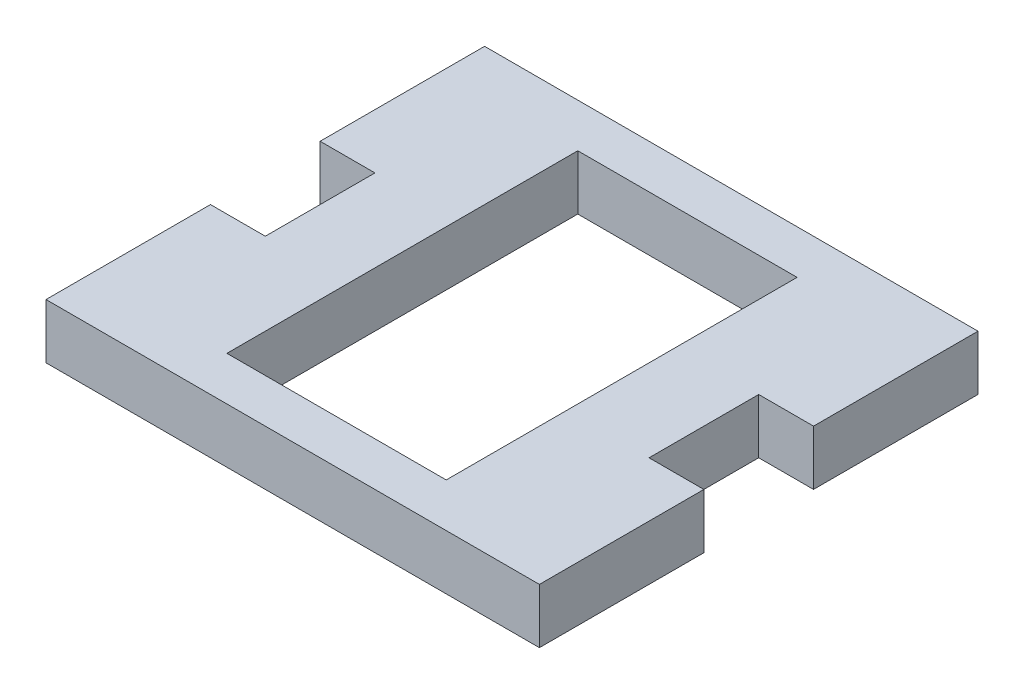
ISO-10303-21;
HEADER;
FILE_DESCRIPTION(('STEP AP214'),'2;1');
FILE_NAME('part.step','',(''),(''),'','','');
FILE_SCHEMA(('AUTOMOTIVE_DESIGN { 1 0 10303 214 1 1 1 1 }'));
ENDSEC;
DATA;
#1=APPLICATION_CONTEXT('core data for automotive mechanical design processes');
#2=APPLICATION_PROTOCOL_DEFINITION('international standard','automotive_design',2000,#1);
#3=PRODUCT_CONTEXT('',#1,'mechanical');
#4=PRODUCT('Part','Part','',(#3));
#5=PRODUCT_RELATED_PRODUCT_CATEGORY('part','',(#4));
#6=PRODUCT_DEFINITION_FORMATION('','',#4);
#7=PRODUCT_DEFINITION_CONTEXT('part definition',#1,'design');
#8=PRODUCT_DEFINITION('design','',#6,#7);
#9=PRODUCT_DEFINITION_SHAPE('','',#8);
#10=(LENGTH_UNIT() NAMED_UNIT(*) SI_UNIT(.MILLI.,.METRE.));
#11=(NAMED_UNIT(*) PLANE_ANGLE_UNIT() SI_UNIT($,.RADIAN.));
#12=(NAMED_UNIT(*) SI_UNIT($,.STERADIAN.) SOLID_ANGLE_UNIT());
#13=UNCERTAINTY_MEASURE_WITH_UNIT(LENGTH_MEASURE(1.E-05),#10,'distance_accuracy_value','');
#14=(GEOMETRIC_REPRESENTATION_CONTEXT(3) GLOBAL_UNCERTAINTY_ASSIGNED_CONTEXT((#13)) GLOBAL_UNIT_ASSIGNED_CONTEXT((#10,
#11,#12)) REPRESENTATION_CONTEXT('',''));
#15=CARTESIAN_POINT('',(0.,0.,0.));
#16=DIRECTION('',(0.,0.,1.));
#17=DIRECTION('',(1.,0.,0.));
#18=AXIS2_PLACEMENT_3D('',#15,#16,#17);
#19=CARTESIAN_POINT('',(0.,3.175,0.));
#20=DIRECTION('',(0.,-1.,0.));
#21=DIRECTION('',(0.,0.,-1.));
#22=AXIS2_PLACEMENT_3D('',#19,#20,#21);
#23=PLANE('',#22);
#24=DIRECTION('',(0.,0.,-1.));
#25=VECTOR('',#24,1.);
#26=CARTESIAN_POINT('',(14.2875,3.175,-12.7));
#27=LINE('',#26,#25);
#28=CARTESIAN_POINT('',(14.2875,3.175,-3.175));
#29=VERTEX_POINT('',#28);
#30=CARTESIAN_POINT('',(14.2875,3.175,-12.7));
#31=VERTEX_POINT('',#30);
#32=EDGE_CURVE('E184',#29,#31,#27,.T.);
#33=ORIENTED_EDGE('',*,*,#32,.T.);
#34=DIRECTION('',(-1.,0.,0.));
#35=VECTOR('',#34,1.);
#36=CARTESIAN_POINT('',(-14.2875,3.175,-12.7));
#37=LINE('',#36,#35);
#38=CARTESIAN_POINT('',(-14.2875,3.175,-12.7));
#39=VERTEX_POINT('',#38);
#40=EDGE_CURVE('E187',#31,#39,#37,.T.);
#41=ORIENTED_EDGE('',*,*,#40,.T.);
#42=DIRECTION('',(0.,0.,1.));
#43=VECTOR('',#42,1.);
#44=CARTESIAN_POINT('',(-14.2875,3.175,-12.7));
#45=LINE('',#44,#43);
#46=CARTESIAN_POINT('',(-14.2875,3.175,-3.175));
#47=VERTEX_POINT('',#46);
#48=EDGE_CURVE('E190',#39,#47,#45,.T.);
#49=ORIENTED_EDGE('',*,*,#48,.T.);
#50=DIRECTION('',(1.,0.,0.));
#51=VECTOR('',#50,1.);
#52=CARTESIAN_POINT('',(-14.2875,3.175,-3.175));
#53=LINE('',#52,#51);
#54=CARTESIAN_POINT('',(-11.1125,3.175,-3.175));
#55=VERTEX_POINT('',#54);
#56=EDGE_CURVE('E192',#47,#55,#53,.T.);
#57=ORIENTED_EDGE('',*,*,#56,.T.);
#58=DIRECTION('',(0.,0.,1.));
#59=VECTOR('',#58,1.);
#60=CARTESIAN_POINT('',(-11.1125,3.175,-3.175));
#61=LINE('',#60,#59);
#62=CARTESIAN_POINT('',(-11.1125,3.175,3.175));
#63=VERTEX_POINT('',#62);
#64=EDGE_CURVE('E194',#55,#63,#61,.T.);
#65=ORIENTED_EDGE('',*,*,#64,.T.);
#66=DIRECTION('',(-1.,0.,0.));
#67=VECTOR('',#66,1.);
#68=CARTESIAN_POINT('',(-11.1125,3.175,3.175));
#69=LINE('',#68,#67);
#70=CARTESIAN_POINT('',(-14.2875,3.175,3.175));
#71=VERTEX_POINT('',#70);
#72=EDGE_CURVE('E196',#63,#71,#69,.T.);
#73=ORIENTED_EDGE('',*,*,#72,.T.);
#74=DIRECTION('',(0.,0.,1.));
#75=VECTOR('',#74,1.);
#76=CARTESIAN_POINT('',(-14.2875,3.175,12.7));
#77=LINE('',#76,#75);
#78=CARTESIAN_POINT('',(-14.2875,3.175,12.7));
#79=VERTEX_POINT('',#78);
#80=EDGE_CURVE('E198',#71,#79,#77,.T.);
#81=ORIENTED_EDGE('',*,*,#80,.T.);
#82=DIRECTION('',(1.,0.,0.));
#83=VECTOR('',#82,1.);
#84=CARTESIAN_POINT('',(-14.2875,3.175,12.7));
#85=LINE('',#84,#83);
#86=CARTESIAN_POINT('',(14.2875,3.175,12.7));
#87=VERTEX_POINT('',#86);
#88=EDGE_CURVE('E200',#79,#87,#85,.T.);
#89=ORIENTED_EDGE('',*,*,#88,.T.);
#90=DIRECTION('',(0.,0.,-1.));
#91=VECTOR('',#90,1.);
#92=CARTESIAN_POINT('',(14.2875,3.175,12.7));
#93=LINE('',#92,#91);
#94=CARTESIAN_POINT('',(14.2875,3.175,3.175));
#95=VERTEX_POINT('',#94);
#96=EDGE_CURVE('E202',#87,#95,#93,.T.);
#97=ORIENTED_EDGE('',*,*,#96,.T.);
#98=DIRECTION('',(-1.,0.,0.));
#99=VECTOR('',#98,1.);
#100=CARTESIAN_POINT('',(11.1125,3.175,3.175));
#101=LINE('',#100,#99);
#102=CARTESIAN_POINT('',(11.1125,3.175,3.175));
#103=VERTEX_POINT('',#102);
#104=EDGE_CURVE('E204',#95,#103,#101,.T.);
#105=ORIENTED_EDGE('',*,*,#104,.T.);
#106=DIRECTION('',(0.,0.,-1.));
#107=VECTOR('',#106,1.);
#108=CARTESIAN_POINT('',(11.1125,3.175,-3.175));
#109=LINE('',#108,#107);
#110=CARTESIAN_POINT('',(11.1125,3.175,-3.175));
#111=VERTEX_POINT('',#110);
#112=EDGE_CURVE('E206',#103,#111,#109,.T.);
#113=ORIENTED_EDGE('',*,*,#112,.T.);
#114=DIRECTION('',(1.,0.,0.));
#115=VECTOR('',#114,1.);
#116=CARTESIAN_POINT('',(14.2875,3.175,-3.175));
#117=LINE('',#116,#115);
#118=EDGE_CURVE('E208',#111,#29,#117,.T.);
#119=ORIENTED_EDGE('',*,*,#118,.T.);
#120=EDGE_LOOP('',(#33,#41,#49,#57,#65,#73,#81,#89,#97,#105,#113,#119));
#121=FACE_BOUND('',#120,.T.);
#122=DIRECTION('',(0.,0.,-1.));
#123=VECTOR('',#122,1.);
#124=CARTESIAN_POINT('',(6.35,3.175,10.16));
#125=LINE('',#124,#123);
#126=CARTESIAN_POINT('',(6.35,3.175,10.16));
#127=VERTEX_POINT('',#126);
#128=CARTESIAN_POINT('',(6.35,3.175,-10.16));
#129=VERTEX_POINT('',#128);
#130=EDGE_CURVE('E148',#127,#129,#125,.T.);
#131=ORIENTED_EDGE('',*,*,#130,.F.);
#132=DIRECTION('',(1.,0.,0.));
#133=VECTOR('',#132,1.);
#134=CARTESIAN_POINT('',(-6.35,3.175,10.16));
#135=LINE('',#134,#133);
#136=CARTESIAN_POINT('',(-6.35,3.175,10.16));
#137=VERTEX_POINT('',#136);
#138=EDGE_CURVE('E170',#137,#127,#135,.T.);
#139=ORIENTED_EDGE('',*,*,#138,.F.);
#140=DIRECTION('',(0.,0.,1.));
#141=VECTOR('',#140,1.);
#142=CARTESIAN_POINT('',(-6.35,3.175,10.16));
#143=LINE('',#142,#141);
#144=CARTESIAN_POINT('',(-6.35,3.175,-10.16));
#145=VERTEX_POINT('',#144);
#146=EDGE_CURVE('E168',#145,#137,#143,.T.);
#147=ORIENTED_EDGE('',*,*,#146,.F.);
#148=DIRECTION('',(-1.,0.,0.));
#149=VECTOR('',#148,1.);
#150=CARTESIAN_POINT('',(-6.35,3.175,-10.16));
#151=LINE('',#150,#149);
#152=EDGE_CURVE('E156',#129,#145,#151,.T.);
#153=ORIENTED_EDGE('',*,*,#152,.F.);
#154=EDGE_LOOP('',(#131,#139,#147,#153));
#155=FACE_BOUND('',#154,.T.);
#156=ADVANCED_FACE('F35',(#121,#155),#23,.F.);
#157=CARTESIAN_POINT('',(0.,0.,0.));
#158=DIRECTION('',(0.,-1.,0.));
#159=DIRECTION('',(0.,0.,-1.));
#160=AXIS2_PLACEMENT_3D('',#157,#158,#159);
#161=PLANE('',#160);
#162=DIRECTION('',(0.,0.,-1.));
#163=VECTOR('',#162,1.);
#164=CARTESIAN_POINT('',(14.2875,0.,-12.7));
#165=LINE('',#164,#163);
#166=CARTESIAN_POINT('',(14.2875,0.,-3.175));
#167=VERTEX_POINT('',#166);
#168=CARTESIAN_POINT('',(14.2875,0.,-12.7));
#169=VERTEX_POINT('',#168);
#170=EDGE_CURVE('E164',#167,#169,#165,.T.);
#171=ORIENTED_EDGE('',*,*,#170,.F.);
#172=DIRECTION('',(1.,0.,0.));
#173=VECTOR('',#172,1.);
#174=CARTESIAN_POINT('',(14.2875,0.,-3.175));
#175=LINE('',#174,#173);
#176=CARTESIAN_POINT('',(11.1125,0.,-3.175));
#177=VERTEX_POINT('',#176);
#178=EDGE_CURVE('E188',#177,#167,#175,.T.);
#179=ORIENTED_EDGE('',*,*,#178,.F.);
#180=DIRECTION('',(0.,0.,-1.));
#181=VECTOR('',#180,1.);
#182=CARTESIAN_POINT('',(11.1125,0.,-3.175));
#183=LINE('',#182,#181);
#184=CARTESIAN_POINT('',(11.1125,0.,3.175));
#185=VERTEX_POINT('',#184);
#186=EDGE_CURVE('E231',#185,#177,#183,.T.);
#187=ORIENTED_EDGE('',*,*,#186,.F.);
#188=DIRECTION('',(-1.,0.,0.));
#189=VECTOR('',#188,1.);
#190=CARTESIAN_POINT('',(11.1125,0.,3.175));
#191=LINE('',#190,#189);
#192=CARTESIAN_POINT('',(14.2875,0.,3.175));
#193=VERTEX_POINT('',#192);
#194=EDGE_CURVE('E229',#193,#185,#191,.T.);
#195=ORIENTED_EDGE('',*,*,#194,.F.);
#196=DIRECTION('',(0.,0.,-1.));
#197=VECTOR('',#196,1.);
#198=CARTESIAN_POINT('',(14.2875,0.,12.7));
#199=LINE('',#198,#197);
#200=CARTESIAN_POINT('',(14.2875,0.,12.7));
#201=VERTEX_POINT('',#200);
#202=EDGE_CURVE('E227',#201,#193,#199,.T.);
#203=ORIENTED_EDGE('',*,*,#202,.F.);
#204=DIRECTION('',(1.,0.,0.));
#205=VECTOR('',#204,1.);
#206=CARTESIAN_POINT('',(-14.2875,0.,12.7));
#207=LINE('',#206,#205);
#208=CARTESIAN_POINT('',(-14.2875,0.,12.7));
#209=VERTEX_POINT('',#208);
#210=EDGE_CURVE('E225',#209,#201,#207,.T.);
#211=ORIENTED_EDGE('',*,*,#210,.F.);
#212=DIRECTION('',(0.,0.,1.));
#213=VECTOR('',#212,1.);
#214=CARTESIAN_POINT('',(-14.2875,0.,12.7));
#215=LINE('',#214,#213);
#216=CARTESIAN_POINT('',(-14.2875,0.,3.175));
#217=VERTEX_POINT('',#216);
#218=EDGE_CURVE('E223',#217,#209,#215,.T.);
#219=ORIENTED_EDGE('',*,*,#218,.F.);
#220=DIRECTION('',(-1.,0.,0.));
#221=VECTOR('',#220,1.);
#222=CARTESIAN_POINT('',(-11.1125,0.,3.175));
#223=LINE('',#222,#221);
#224=CARTESIAN_POINT('',(-11.1125,0.,3.175));
#225=VERTEX_POINT('',#224);
#226=EDGE_CURVE('E221',#225,#217,#223,.T.);
#227=ORIENTED_EDGE('',*,*,#226,.F.);
#228=DIRECTION('',(0.,0.,1.));
#229=VECTOR('',#228,1.);
#230=CARTESIAN_POINT('',(-11.1125,0.,-3.175));
#231=LINE('',#230,#229);
#232=CARTESIAN_POINT('',(-11.1125,0.,-3.175));
#233=VERTEX_POINT('',#232);
#234=EDGE_CURVE('E219',#233,#225,#231,.T.);
#235=ORIENTED_EDGE('',*,*,#234,.F.);
#236=DIRECTION('',(1.,0.,0.));
#237=VECTOR('',#236,1.);
#238=CARTESIAN_POINT('',(-14.2875,0.,-3.175));
#239=LINE('',#238,#237);
#240=CARTESIAN_POINT('',(-14.2875,0.,-3.175));
#241=VERTEX_POINT('',#240);
#242=EDGE_CURVE('E217',#241,#233,#239,.T.);
#243=ORIENTED_EDGE('',*,*,#242,.F.);
#244=DIRECTION('',(0.,0.,1.));
#245=VECTOR('',#244,1.);
#246=CARTESIAN_POINT('',(-14.2875,0.,-12.7));
#247=LINE('',#246,#245);
#248=CARTESIAN_POINT('',(-14.2875,0.,-12.7));
#249=VERTEX_POINT('',#248);
#250=EDGE_CURVE('E215',#249,#241,#247,.T.);
#251=ORIENTED_EDGE('',*,*,#250,.F.);
#252=DIRECTION('',(-1.,0.,0.));
#253=VECTOR('',#252,1.);
#254=CARTESIAN_POINT('',(-14.2875,0.,-12.7));
#255=LINE('',#254,#253);
#256=EDGE_CURVE('E213',#169,#249,#255,.T.);
#257=ORIENTED_EDGE('',*,*,#256,.F.);
#258=EDGE_LOOP('',(#171,#179,#187,#195,#203,#211,#219,#227,#235,#243,#251,#257));
#259=FACE_BOUND('',#258,.T.);
#260=DIRECTION('',(1.,0.,0.));
#261=VECTOR('',#260,1.);
#262=CARTESIAN_POINT('',(-6.35,0.,10.16));
#263=LINE('',#262,#261);
#264=CARTESIAN_POINT('',(-6.35,0.,10.16));
#265=VERTEX_POINT('',#264);
#266=CARTESIAN_POINT('',(6.35,0.,10.16));
#267=VERTEX_POINT('',#266);
#268=EDGE_CURVE('E157',#265,#267,#263,.T.);
#269=ORIENTED_EDGE('',*,*,#268,.T.);
#270=DIRECTION('',(0.,0.,-1.));
#271=VECTOR('',#270,1.);
#272=CARTESIAN_POINT('',(6.35,0.,10.16));
#273=LINE('',#272,#271);
#274=CARTESIAN_POINT('',(6.35,0.,-10.16));
#275=VERTEX_POINT('',#274);
#276=EDGE_CURVE('E58',#267,#275,#273,.T.);
#277=ORIENTED_EDGE('',*,*,#276,.T.);
#278=DIRECTION('',(-1.,0.,0.));
#279=VECTOR('',#278,1.);
#280=CARTESIAN_POINT('',(-6.35,0.,-10.16));
#281=LINE('',#280,#279);
#282=CARTESIAN_POINT('',(-6.35,0.,-10.16));
#283=VERTEX_POINT('',#282);
#284=EDGE_CURVE('E163',#275,#283,#281,.T.);
#285=ORIENTED_EDGE('',*,*,#284,.T.);
#286=DIRECTION('',(0.,0.,1.));
#287=VECTOR('',#286,1.);
#288=CARTESIAN_POINT('',(-6.35,0.,10.16));
#289=LINE('',#288,#287);
#290=EDGE_CURVE('E176',#283,#265,#289,.T.);
#291=ORIENTED_EDGE('',*,*,#290,.T.);
#292=EDGE_LOOP('',(#269,#277,#285,#291));
#293=FACE_BOUND('',#292,.T.);
#294=ADVANCED_FACE('F273',(#259,#293),#161,.T.);
#295=CARTESIAN_POINT('',(14.2875,3.175,-12.7));
#296=DIRECTION('',(-1.,0.,0.));
#297=DIRECTION('',(0.,0.,1.));
#298=AXIS2_PLACEMENT_3D('',#295,#296,#297);
#299=PLANE('',#298);
#300=ORIENTED_EDGE('',*,*,#170,.T.);
#301=DIRECTION('',(0.,-1.,0.));
#302=VECTOR('',#301,1.);
#303=CARTESIAN_POINT('',(14.2875,3.175,-12.7));
#304=LINE('',#303,#302);
#305=EDGE_CURVE('E11',#31,#169,#304,.T.);
#306=ORIENTED_EDGE('',*,*,#305,.F.);
#307=ORIENTED_EDGE('',*,*,#32,.F.);
#308=DIRECTION('',(0.,-1.,0.));
#309=VECTOR('',#308,1.);
#310=CARTESIAN_POINT('',(14.2875,3.175,-3.175));
#311=LINE('',#310,#309);
#312=EDGE_CURVE('E210',#29,#167,#311,.T.);
#313=ORIENTED_EDGE('',*,*,#312,.T.);
#314=EDGE_LOOP('',(#300,#306,#307,#313));
#315=FACE_BOUND('',#314,.T.);
#316=ADVANCED_FACE('F37',(#315),#299,.F.);
#317=CARTESIAN_POINT('',(-14.2875,3.175,-12.7));
#318=DIRECTION('',(0.,0.,1.));
#319=DIRECTION('',(1.,0.,0.));
#320=AXIS2_PLACEMENT_3D('',#317,#318,#319);
#321=PLANE('',#320);
#322=ORIENTED_EDGE('',*,*,#256,.T.);
#323=DIRECTION('',(0.,-1.,0.));
#324=VECTOR('',#323,1.);
#325=CARTESIAN_POINT('',(-14.2875,3.175,-12.7));
#326=LINE('',#325,#324);
#327=EDGE_CURVE('E43',#39,#249,#326,.T.);
#328=ORIENTED_EDGE('',*,*,#327,.F.);
#329=ORIENTED_EDGE('',*,*,#40,.F.);
#330=ORIENTED_EDGE('',*,*,#305,.T.);
#331=EDGE_LOOP('',(#322,#328,#329,#330));
#332=FACE_BOUND('',#331,.T.);
#333=ADVANCED_FACE('F290',(#332),#321,.F.);
#334=CARTESIAN_POINT('',(-14.2875,3.175,-12.7));
#335=DIRECTION('',(1.,0.,0.));
#336=DIRECTION('',(0.,0.,-1.));
#337=AXIS2_PLACEMENT_3D('',#334,#335,#336);
#338=PLANE('',#337);
#339=ORIENTED_EDGE('',*,*,#250,.T.);
#340=DIRECTION('',(0.,-1.,0.));
#341=VECTOR('',#340,1.);
#342=CARTESIAN_POINT('',(-14.2875,3.175,-3.175));
#343=LINE('',#342,#341);
#344=EDGE_CURVE('E260',#47,#241,#343,.T.);
#345=ORIENTED_EDGE('',*,*,#344,.F.);
#346=ORIENTED_EDGE('',*,*,#48,.F.);
#347=ORIENTED_EDGE('',*,*,#327,.T.);
#348=EDGE_LOOP('',(#339,#345,#346,#347));
#349=FACE_BOUND('',#348,.T.);
#350=ADVANCED_FACE('F267',(#349),#338,.F.);
#351=CARTESIAN_POINT('',(-14.2875,3.175,-3.175));
#352=DIRECTION('',(0.,0.,-1.));
#353=DIRECTION('',(-1.,0.,0.));
#354=AXIS2_PLACEMENT_3D('',#351,#352,#353);
#355=PLANE('',#354);
#356=ORIENTED_EDGE('',*,*,#242,.T.);
#357=DIRECTION('',(0.,-1.,0.));
#358=VECTOR('',#357,1.);
#359=CARTESIAN_POINT('',(-11.1125,3.175,-3.175));
#360=LINE('',#359,#358);
#361=EDGE_CURVE('E257',#55,#233,#360,.T.);
#362=ORIENTED_EDGE('',*,*,#361,.F.);
#363=ORIENTED_EDGE('',*,*,#56,.F.);
#364=ORIENTED_EDGE('',*,*,#344,.T.);
#365=EDGE_LOOP('',(#356,#362,#363,#364));
#366=FACE_BOUND('',#365,.T.);
#367=ADVANCED_FACE('F279',(#366),#355,.F.);
#368=CARTESIAN_POINT('',(-11.1125,3.175,-3.175));
#369=DIRECTION('',(1.,0.,0.));
#370=DIRECTION('',(0.,0.,-1.));
#371=AXIS2_PLACEMENT_3D('',#368,#369,#370);
#372=PLANE('',#371);
#373=ORIENTED_EDGE('',*,*,#234,.T.);
#374=DIRECTION('',(0.,-1.,0.));
#375=VECTOR('',#374,1.);
#376=CARTESIAN_POINT('',(-11.1125,3.175,3.175));
#377=LINE('',#376,#375);
#378=EDGE_CURVE('E254',#63,#225,#377,.T.);
#379=ORIENTED_EDGE('',*,*,#378,.F.);
#380=ORIENTED_EDGE('',*,*,#64,.F.);
#381=ORIENTED_EDGE('',*,*,#361,.T.);
#382=EDGE_LOOP('',(#373,#379,#380,#381));
#383=FACE_BOUND('',#382,.T.);
#384=ADVANCED_FACE('F283',(#383),#372,.F.);
#385=CARTESIAN_POINT('',(-11.1125,3.175,3.175));
#386=DIRECTION('',(0.,0.,1.));
#387=DIRECTION('',(1.,0.,0.));
#388=AXIS2_PLACEMENT_3D('',#385,#386,#387);
#389=PLANE('',#388);
#390=ORIENTED_EDGE('',*,*,#226,.T.);
#391=DIRECTION('',(0.,-1.,0.));
#392=VECTOR('',#391,1.);
#393=CARTESIAN_POINT('',(-14.2875,3.175,3.175));
#394=LINE('',#393,#392);
#395=EDGE_CURVE('E251',#71,#217,#394,.T.);
#396=ORIENTED_EDGE('',*,*,#395,.F.);
#397=ORIENTED_EDGE('',*,*,#72,.F.);
#398=ORIENTED_EDGE('',*,*,#378,.T.);
#399=EDGE_LOOP('',(#390,#396,#397,#398));
#400=FACE_BOUND('',#399,.T.);
#401=ADVANCED_FACE('F323',(#400),#389,.F.);
#402=CARTESIAN_POINT('',(-14.2875,3.175,12.7));
#403=DIRECTION('',(1.,0.,0.));
#404=DIRECTION('',(0.,0.,-1.));
#405=AXIS2_PLACEMENT_3D('',#402,#403,#404);
#406=PLANE('',#405);
#407=ORIENTED_EDGE('',*,*,#218,.T.);
#408=DIRECTION('',(0.,-1.,0.));
#409=VECTOR('',#408,1.);
#410=CARTESIAN_POINT('',(-14.2875,3.175,12.7));
#411=LINE('',#410,#409);
#412=EDGE_CURVE('E248',#79,#209,#411,.T.);
#413=ORIENTED_EDGE('',*,*,#412,.F.);
#414=ORIENTED_EDGE('',*,*,#80,.F.);
#415=ORIENTED_EDGE('',*,*,#395,.T.);
#416=EDGE_LOOP('',(#407,#413,#414,#415));
#417=FACE_BOUND('',#416,.T.);
#418=ADVANCED_FACE('F321',(#417),#406,.F.);
#419=CARTESIAN_POINT('',(-14.2875,3.175,12.7));
#420=DIRECTION('',(0.,0.,-1.));
#421=DIRECTION('',(-1.,0.,0.));
#422=AXIS2_PLACEMENT_3D('',#419,#420,#421);
#423=PLANE('',#422);
#424=ORIENTED_EDGE('',*,*,#210,.T.);
#425=DIRECTION('',(0.,-1.,0.));
#426=VECTOR('',#425,1.);
#427=CARTESIAN_POINT('',(14.2875,3.175,12.7));
#428=LINE('',#427,#426);
#429=EDGE_CURVE('E245',#87,#201,#428,.T.);
#430=ORIENTED_EDGE('',*,*,#429,.F.);
#431=ORIENTED_EDGE('',*,*,#88,.F.);
#432=ORIENTED_EDGE('',*,*,#412,.T.);
#433=EDGE_LOOP('',(#424,#430,#431,#432));
#434=FACE_BOUND('',#433,.T.);
#435=ADVANCED_FACE('F317',(#434),#423,.F.);
#436=CARTESIAN_POINT('',(14.2875,3.175,12.7));
#437=DIRECTION('',(-1.,0.,0.));
#438=DIRECTION('',(0.,0.,1.));
#439=AXIS2_PLACEMENT_3D('',#436,#437,#438);
#440=PLANE('',#439);
#441=ORIENTED_EDGE('',*,*,#202,.T.);
#442=DIRECTION('',(0.,-1.,0.));
#443=VECTOR('',#442,1.);
#444=CARTESIAN_POINT('',(14.2875,3.175,3.175));
#445=LINE('',#444,#443);
#446=EDGE_CURVE('E242',#95,#193,#445,.T.);
#447=ORIENTED_EDGE('',*,*,#446,.F.);
#448=ORIENTED_EDGE('',*,*,#96,.F.);
#449=ORIENTED_EDGE('',*,*,#429,.T.);
#450=EDGE_LOOP('',(#441,#447,#448,#449));
#451=FACE_BOUND('',#450,.T.);
#452=ADVANCED_FACE('F312',(#451),#440,.F.);
#453=CARTESIAN_POINT('',(11.1125,3.175,3.175));
#454=DIRECTION('',(0.,0.,1.));
#455=DIRECTION('',(1.,0.,0.));
#456=AXIS2_PLACEMENT_3D('',#453,#454,#455);
#457=PLANE('',#456);
#458=ORIENTED_EDGE('',*,*,#194,.T.);
#459=DIRECTION('',(0.,-1.,0.));
#460=VECTOR('',#459,1.);
#461=CARTESIAN_POINT('',(11.1125,3.175,3.175));
#462=LINE('',#461,#460);
#463=EDGE_CURVE('E239',#103,#185,#462,.T.);
#464=ORIENTED_EDGE('',*,*,#463,.F.);
#465=ORIENTED_EDGE('',*,*,#104,.F.);
#466=ORIENTED_EDGE('',*,*,#446,.T.);
#467=EDGE_LOOP('',(#458,#464,#465,#466));
#468=FACE_BOUND('',#467,.T.);
#469=ADVANCED_FACE('F306',(#468),#457,.F.);
#470=CARTESIAN_POINT('',(11.1125,3.175,-3.175));
#471=DIRECTION('',(-1.,0.,0.));
#472=DIRECTION('',(0.,0.,1.));
#473=AXIS2_PLACEMENT_3D('',#470,#471,#472);
#474=PLANE('',#473);
#475=ORIENTED_EDGE('',*,*,#186,.T.);
#476=DIRECTION('',(0.,-1.,0.));
#477=VECTOR('',#476,1.);
#478=CARTESIAN_POINT('',(11.1125,3.175,-3.175));
#479=LINE('',#478,#477);
#480=EDGE_CURVE('E236',#111,#177,#479,.T.);
#481=ORIENTED_EDGE('',*,*,#480,.F.);
#482=ORIENTED_EDGE('',*,*,#112,.F.);
#483=ORIENTED_EDGE('',*,*,#463,.T.);
#484=EDGE_LOOP('',(#475,#481,#482,#483));
#485=FACE_BOUND('',#484,.T.);
#486=ADVANCED_FACE('F302',(#485),#474,.F.);
#487=CARTESIAN_POINT('',(14.2875,3.175,-3.175));
#488=DIRECTION('',(0.,0.,-1.));
#489=DIRECTION('',(-1.,0.,0.));
#490=AXIS2_PLACEMENT_3D('',#487,#488,#489);
#491=PLANE('',#490);
#492=ORIENTED_EDGE('',*,*,#178,.T.);
#493=ORIENTED_EDGE('',*,*,#312,.F.);
#494=ORIENTED_EDGE('',*,*,#118,.F.);
#495=ORIENTED_EDGE('',*,*,#480,.T.);
#496=EDGE_LOOP('',(#492,#493,#494,#495));
#497=FACE_BOUND('',#496,.T.);
#498=ADVANCED_FACE('F297',(#497),#491,.F.);
#499=CARTESIAN_POINT('',(6.35,3.175,10.16));
#500=DIRECTION('',(-1.,0.,0.));
#501=DIRECTION('',(0.,0.,1.));
#502=AXIS2_PLACEMENT_3D('',#499,#500,#501);
#503=PLANE('',#502);
#504=ORIENTED_EDGE('',*,*,#276,.F.);
#505=DIRECTION('',(0.,-1.,0.));
#506=VECTOR('',#505,1.);
#507=CARTESIAN_POINT('',(6.35,3.175,10.16));
#508=LINE('',#507,#506);
#509=EDGE_CURVE('E152',#127,#267,#508,.T.);
#510=ORIENTED_EDGE('',*,*,#509,.F.);
#511=ORIENTED_EDGE('',*,*,#130,.T.);
#512=DIRECTION('',(0.,-1.,0.));
#513=VECTOR('',#512,1.);
#514=CARTESIAN_POINT('',(6.35,3.175,-10.16));
#515=LINE('',#514,#513);
#516=EDGE_CURVE('E151',#129,#275,#515,.T.);
#517=ORIENTED_EDGE('',*,*,#516,.T.);
#518=EDGE_LOOP('',(#504,#510,#511,#517));
#519=FACE_BOUND('',#518,.T.);
#520=ADVANCED_FACE('F150',(#519),#503,.T.);
#521=CARTESIAN_POINT('',(-6.35,3.175,-10.16));
#522=DIRECTION('',(0.,0.,1.));
#523=DIRECTION('',(1.,0.,0.));
#524=AXIS2_PLACEMENT_3D('',#521,#522,#523);
#525=PLANE('',#524);
#526=ORIENTED_EDGE('',*,*,#284,.F.);
#527=ORIENTED_EDGE('',*,*,#516,.F.);
#528=ORIENTED_EDGE('',*,*,#152,.T.);
#529=DIRECTION('',(0.,-1.,0.));
#530=VECTOR('',#529,1.);
#531=CARTESIAN_POINT('',(-6.35,3.175,-10.16));
#532=LINE('',#531,#530);
#533=EDGE_CURVE('E165',#145,#283,#532,.T.);
#534=ORIENTED_EDGE('',*,*,#533,.T.);
#535=EDGE_LOOP('',(#526,#527,#528,#534));
#536=FACE_BOUND('',#535,.T.);
#537=ADVANCED_FACE('F160',(#536),#525,.T.);
#538=CARTESIAN_POINT('',(-6.35,3.175,10.16));
#539=DIRECTION('',(1.,0.,0.));
#540=DIRECTION('',(0.,0.,-1.));
#541=AXIS2_PLACEMENT_3D('',#538,#539,#540);
#542=PLANE('',#541);
#543=ORIENTED_EDGE('',*,*,#290,.F.);
#544=ORIENTED_EDGE('',*,*,#533,.F.);
#545=ORIENTED_EDGE('',*,*,#146,.T.);
#546=DIRECTION('',(0.,-1.,0.));
#547=VECTOR('',#546,1.);
#548=CARTESIAN_POINT('',(-6.35,3.175,10.16));
#549=LINE('',#548,#547);
#550=EDGE_CURVE('E50',#137,#265,#549,.T.);
#551=ORIENTED_EDGE('',*,*,#550,.T.);
#552=EDGE_LOOP('',(#543,#544,#545,#551));
#553=FACE_BOUND('',#552,.T.);
#554=ADVANCED_FACE('F381',(#553),#542,.T.);
#555=CARTESIAN_POINT('',(-6.35,3.175,10.16));
#556=DIRECTION('',(0.,0.,-1.));
#557=DIRECTION('',(-1.,0.,0.));
#558=AXIS2_PLACEMENT_3D('',#555,#556,#557);
#559=PLANE('',#558);
#560=ORIENTED_EDGE('',*,*,#268,.F.);
#561=ORIENTED_EDGE('',*,*,#550,.F.);
#562=ORIENTED_EDGE('',*,*,#138,.T.);
#563=ORIENTED_EDGE('',*,*,#509,.T.);
#564=EDGE_LOOP('',(#560,#561,#562,#563));
#565=FACE_BOUND('',#564,.T.);
#566=ADVANCED_FACE('F387',(#565),#559,.T.);
#567=CLOSED_SHELL('',(#156,#294,#316,#333,#350,#367,#384,#401,#418,#435,#452,#469,#486,#498,
#520,#537,#554,#566));
#568=MANIFOLD_SOLID_BREP('B2',#567);
#569=ADVANCED_BREP_SHAPE_REPRESENTATION('',(#18,#568),#14);
#570=SHAPE_DEFINITION_REPRESENTATION(#9,#569);
ENDSEC;
END-ISO-10303-21;
